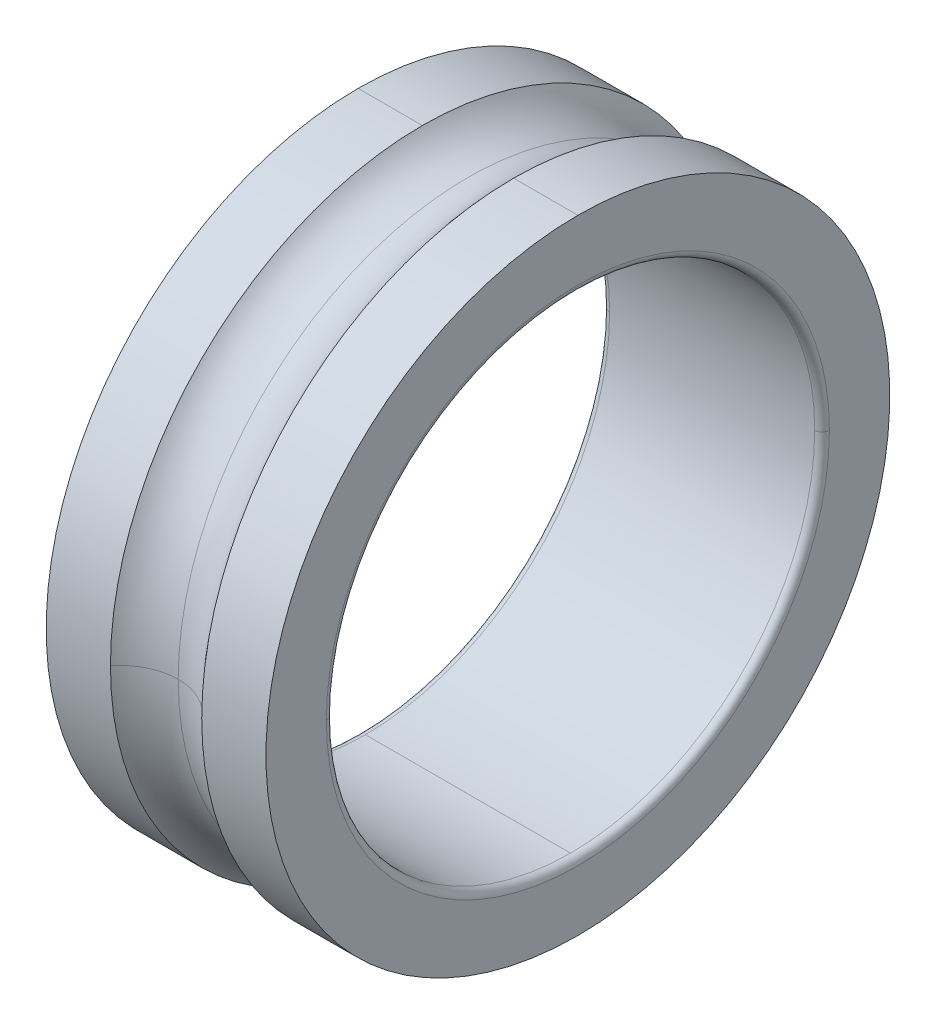
ISO-10303-21;
HEADER;
FILE_DESCRIPTION(('STEP AP214'),'2;1');
FILE_NAME('part.step','',(''),(''),'','','');
FILE_SCHEMA(('AUTOMOTIVE_DESIGN { 1 0 10303 214 1 1 1 1 }'));
ENDSEC;
DATA;
#1=APPLICATION_CONTEXT('core data for automotive mechanical design processes');
#2=APPLICATION_PROTOCOL_DEFINITION('international standard','automotive_design',2000,#1);
#3=PRODUCT_CONTEXT('',#1,'mechanical');
#4=PRODUCT('Part','Part','',(#3));
#5=PRODUCT_RELATED_PRODUCT_CATEGORY('part','',(#4));
#6=PRODUCT_DEFINITION_FORMATION('','',#4);
#7=PRODUCT_DEFINITION_CONTEXT('part definition',#1,'design');
#8=PRODUCT_DEFINITION('design','',#6,#7);
#9=PRODUCT_DEFINITION_SHAPE('','',#8);
#10=(LENGTH_UNIT() NAMED_UNIT(*) SI_UNIT(.MILLI.,.METRE.));
#11=(NAMED_UNIT(*) PLANE_ANGLE_UNIT() SI_UNIT($,.RADIAN.));
#12=(NAMED_UNIT(*) SI_UNIT($,.STERADIAN.) SOLID_ANGLE_UNIT());
#13=UNCERTAINTY_MEASURE_WITH_UNIT(LENGTH_MEASURE(1.E-05),#10,'distance_accuracy_value','');
#14=(GEOMETRIC_REPRESENTATION_CONTEXT(3) GLOBAL_UNCERTAINTY_ASSIGNED_CONTEXT((#13)) GLOBAL_UNIT_ASSIGNED_CONTEXT((#10,
#11,#12)) REPRESENTATION_CONTEXT('',''));
#15=CARTESIAN_POINT('',(0.,0.,0.));
#16=DIRECTION('',(0.,0.,1.));
#17=DIRECTION('',(1.,0.,0.));
#18=AXIS2_PLACEMENT_3D('',#15,#16,#17);
#19=CARTESIAN_POINT('',(7.6845501591675,0.,0.));
#20=DIRECTION('',(1.,0.,0.));
#21=DIRECTION('',(0.,1.,0.));
#22=AXIS2_PLACEMENT_3D('',#19,#20,#21);
#23=CYLINDRICAL_SURFACE('',#22,12.775);
#24=DIRECTION('',(1.,0.,0.));
#25=VECTOR('',#24,1.);
#26=CARTESIAN_POINT('',(7.6845501591675,12.775,0.));
#27=LINE('',#26,#25);
#28=CARTESIAN_POINT('',(6.36910031833499,12.775,0.));
#29=VERTEX_POINT('',#28);
#30=CARTESIAN_POINT('',(9.,12.775,0.));
#31=VERTEX_POINT('',#30);
#32=EDGE_CURVE('E184',#29,#31,#27,.T.);
#33=ORIENTED_EDGE('',*,*,#32,.T.);
#34=CARTESIAN_POINT('',(9.,0.,0.));
#35=DIRECTION('',(1.,0.,0.));
#36=DIRECTION('',(0.,1.,0.));
#37=AXIS2_PLACEMENT_3D('',#34,#35,#36);
#38=CIRCLE('',#37,12.775);
#39=CARTESIAN_POINT('',(9.,-12.775,0.));
#40=VERTEX_POINT('',#39);
#41=EDGE_CURVE('E138',#40,#31,#38,.T.);
#42=ORIENTED_EDGE('',*,*,#41,.F.);
#43=DIRECTION('',(-1.,0.,0.));
#44=VECTOR('',#43,1.);
#45=CARTESIAN_POINT('',(7.6845501591675,-12.775,0.));
#46=LINE('',#45,#44);
#47=CARTESIAN_POINT('',(6.36910031833499,-12.775,0.));
#48=VERTEX_POINT('',#47);
#49=EDGE_CURVE('E192',#40,#48,#46,.T.);
#50=ORIENTED_EDGE('',*,*,#49,.T.);
#51=CARTESIAN_POINT('',(6.36910031833499,0.,0.));
#52=DIRECTION('',(1.,0.,0.));
#53=DIRECTION('',(0.,1.,0.));
#54=AXIS2_PLACEMENT_3D('',#51,#52,#53);
#55=CIRCLE('',#54,12.775);
#56=CARTESIAN_POINT('',(6.36910031833499,0.,-12.775));
#57=VERTEX_POINT('',#56);
#58=EDGE_CURVE('E175',#48,#57,#55,.T.);
#59=ORIENTED_EDGE('',*,*,#58,.T.);
#60=CARTESIAN_POINT('',(6.36910031833499,0.,0.));
#61=DIRECTION('',(1.,0.,0.));
#62=DIRECTION('',(0.,1.,0.));
#63=AXIS2_PLACEMENT_3D('',#60,#61,#62);
#64=CIRCLE('',#63,12.775);
#65=EDGE_CURVE('E181',#57,#29,#64,.T.);
#66=ORIENTED_EDGE('',*,*,#65,.T.);
#67=EDGE_LOOP('',(#33,#42,#50,#59,#66));
#68=FACE_BOUND('',#67,.T.);
#69=ADVANCED_FACE('F17',(#68),#23,.T.);
#70=CARTESIAN_POINT('',(4.5,0.,0.));
#71=DIRECTION('',(1.,0.,0.));
#72=DIRECTION('',(0.,0.,-1.));
#73=AXIS2_PLACEMENT_3D('',#70,#71,#72);
#74=TOROIDAL_SURFACE('',#73,14.25,2.381);
#75=CARTESIAN_POINT('',(4.5,0.,0.));
#76=DIRECTION('',(-1.,0.,0.));
#77=DIRECTION('',(0.,0.,1.));
#78=AXIS2_PLACEMENT_3D('',#75,#76,#77);
#79=CIRCLE('',#78,11.869);
#80=CARTESIAN_POINT('',(4.5,0.,11.869));
#81=VERTEX_POINT('',#80);
#82=CARTESIAN_POINT('',(4.5,0.,-11.869));
#83=VERTEX_POINT('',#82);
#84=EDGE_CURVE('E168',#81,#83,#79,.T.);
#85=ORIENTED_EDGE('',*,*,#84,.T.);
#86=CARTESIAN_POINT('',(4.5,0.,-14.25));
#87=DIRECTION('',(0.,-1.,0.));
#88=DIRECTION('',(0.,0.,-1.));
#89=AXIS2_PLACEMENT_3D('',#86,#87,#88);
#90=CIRCLE('',#89,2.381);
#91=CARTESIAN_POINT('',(2.630899681665,0.,-12.775));
#92=VERTEX_POINT('',#91);
#93=EDGE_CURVE('E161',#83,#92,#90,.T.);
#94=ORIENTED_EDGE('',*,*,#93,.T.);
#95=CARTESIAN_POINT('',(2.630899681665,0.,0.));
#96=DIRECTION('',(1.,0.,0.));
#97=DIRECTION('',(0.,1.,0.));
#98=AXIS2_PLACEMENT_3D('',#95,#96,#97);
#99=CIRCLE('',#98,12.775);
#100=CARTESIAN_POINT('',(2.630899681665,12.775,0.));
#101=VERTEX_POINT('',#100);
#102=EDGE_CURVE('E11',#92,#101,#99,.T.);
#103=ORIENTED_EDGE('',*,*,#102,.T.);
#104=CARTESIAN_POINT('',(2.630899681665,0.,0.));
#105=DIRECTION('',(1.,0.,0.));
#106=DIRECTION('',(0.,1.,0.));
#107=AXIS2_PLACEMENT_3D('',#104,#105,#106);
#108=CIRCLE('',#107,12.775);
#109=CARTESIAN_POINT('',(2.630899681665,0.,12.775));
#110=VERTEX_POINT('',#109);
#111=EDGE_CURVE('E160',#101,#110,#108,.T.);
#112=ORIENTED_EDGE('',*,*,#111,.T.);
#113=CARTESIAN_POINT('',(4.5,0.,14.25));
#114=DIRECTION('',(0.,-1.,0.));
#115=DIRECTION('',(0.,0.,1.));
#116=AXIS2_PLACEMENT_3D('',#113,#114,#115);
#117=CIRCLE('',#116,2.381);
#118=EDGE_CURVE('E202',#110,#81,#117,.T.);
#119=ORIENTED_EDGE('',*,*,#118,.T.);
#120=EDGE_LOOP('',(#85,#94,#103,#112,#119));
#121=FACE_BOUND('',#120,.T.);
#122=ADVANCED_FACE('F260',(#121),#74,.F.);
#123=CARTESIAN_POINT('',(1.3154498408325,0.,0.));
#124=DIRECTION('',(1.,0.,0.));
#125=DIRECTION('',(0.,1.,0.));
#126=AXIS2_PLACEMENT_3D('',#123,#124,#125);
#127=CYLINDRICAL_SURFACE('',#126,12.775);
#128=DIRECTION('',(1.,0.,0.));
#129=VECTOR('',#128,1.);
#130=CARTESIAN_POINT('',(1.3154498408325,12.775,0.));
#131=LINE('',#130,#129);
#132=CARTESIAN_POINT('',(0.,12.775,0.));
#133=VERTEX_POINT('',#132);
#134=EDGE_CURVE('E149',#133,#101,#131,.T.);
#135=ORIENTED_EDGE('',*,*,#134,.T.);
#136=ORIENTED_EDGE('',*,*,#102,.F.);
#137=CARTESIAN_POINT('',(2.630899681665,0.,0.));
#138=DIRECTION('',(1.,0.,0.));
#139=DIRECTION('',(0.,1.,0.));
#140=AXIS2_PLACEMENT_3D('',#137,#138,#139);
#141=CIRCLE('',#140,12.775);
#142=CARTESIAN_POINT('',(2.630899681665,-12.775,0.));
#143=VERTEX_POINT('',#142);
#144=EDGE_CURVE('E164',#143,#92,#141,.T.);
#145=ORIENTED_EDGE('',*,*,#144,.F.);
#146=DIRECTION('',(-1.,0.,0.));
#147=VECTOR('',#146,1.);
#148=CARTESIAN_POINT('',(1.3154498408325,-12.775,0.));
#149=LINE('',#148,#147);
#150=CARTESIAN_POINT('',(0.,-12.775,0.));
#151=VERTEX_POINT('',#150);
#152=EDGE_CURVE('E151',#143,#151,#149,.T.);
#153=ORIENTED_EDGE('',*,*,#152,.T.);
#154=CARTESIAN_POINT('',(0.,0.,0.));
#155=DIRECTION('',(1.,0.,0.));
#156=DIRECTION('',(0.,1.,0.));
#157=AXIS2_PLACEMENT_3D('',#154,#155,#156);
#158=CIRCLE('',#157,12.775);
#159=EDGE_CURVE('E25',#151,#133,#158,.T.);
#160=ORIENTED_EDGE('',*,*,#159,.T.);
#161=EDGE_LOOP('',(#135,#136,#145,#153,#160));
#162=FACE_BOUND('',#161,.T.);
#163=ADVANCED_FACE('F147',(#162),#127,.T.);
#164=CARTESIAN_POINT('',(0.,11.5375,0.));
#165=DIRECTION('',(-1.,0.,0.));
#166=DIRECTION('',(0.,0.,1.));
#167=AXIS2_PLACEMENT_3D('',#164,#165,#166);
#168=PLANE('',#167);
#169=CARTESIAN_POINT('',(0.,0.,0.));
#170=DIRECTION('',(1.,0.,0.));
#171=DIRECTION('',(0.,1.,0.));
#172=AXIS2_PLACEMENT_3D('',#169,#170,#171);
#173=CIRCLE('',#172,10.3);
#174=CARTESIAN_POINT('',(0.,0.,10.3));
#175=VERTEX_POINT('',#174);
#176=CARTESIAN_POINT('',(0.,0.,-10.3));
#177=VERTEX_POINT('',#176);
#178=EDGE_CURVE('E141',#175,#177,#173,.T.);
#179=ORIENTED_EDGE('',*,*,#178,.T.);
#180=CARTESIAN_POINT('',(0.,0.,0.));
#181=DIRECTION('',(1.,0.,0.));
#182=DIRECTION('',(0.,1.,0.));
#183=AXIS2_PLACEMENT_3D('',#180,#181,#182);
#184=CIRCLE('',#183,10.3);
#185=EDGE_CURVE('E223',#177,#175,#184,.T.);
#186=ORIENTED_EDGE('',*,*,#185,.T.);
#187=EDGE_LOOP('',(#179,#186));
#188=FACE_BOUND('',#187,.T.);
#189=CARTESIAN_POINT('',(0.,0.,0.));
#190=DIRECTION('',(1.,0.,0.));
#191=DIRECTION('',(0.,1.,0.));
#192=AXIS2_PLACEMENT_3D('',#189,#190,#191);
#193=CIRCLE('',#192,12.775);
#194=EDGE_CURVE('E154',#133,#151,#193,.T.);
#195=ORIENTED_EDGE('',*,*,#194,.F.);
#196=ORIENTED_EDGE('',*,*,#159,.F.);
#197=EDGE_LOOP('',(#195,#196));
#198=FACE_BOUND('',#197,.T.);
#199=ADVANCED_FACE('F19',(#188,#198),#168,.T.);
#200=CARTESIAN_POINT('',(0.3,0.,0.));
#201=DIRECTION('',(1.,0.,0.));
#202=DIRECTION('',(0.,0.,-1.));
#203=AXIS2_PLACEMENT_3D('',#200,#201,#202);
#204=TOROIDAL_SURFACE('',#203,10.3,0.3);
#205=CARTESIAN_POINT('',(0.3,0.,-10.3));
#206=DIRECTION('',(0.,-1.,0.));
#207=DIRECTION('',(0.,0.,-1.));
#208=AXIS2_PLACEMENT_3D('',#205,#206,#207);
#209=CIRCLE('',#208,0.3);
#210=CARTESIAN_POINT('',(0.3,0.,-10.));
#211=VERTEX_POINT('',#210);
#212=EDGE_CURVE('E211',#211,#177,#209,.T.);
#213=ORIENTED_EDGE('',*,*,#212,.T.);
#214=ORIENTED_EDGE('',*,*,#178,.F.);
#215=CARTESIAN_POINT('',(0.3,0.,10.3));
#216=DIRECTION('',(0.,-1.,0.));
#217=DIRECTION('',(0.,0.,1.));
#218=AXIS2_PLACEMENT_3D('',#215,#216,#217);
#219=CIRCLE('',#218,0.3);
#220=CARTESIAN_POINT('',(0.3,0.,10.));
#221=VERTEX_POINT('',#220);
#222=EDGE_CURVE('E220',#175,#221,#219,.T.);
#223=ORIENTED_EDGE('',*,*,#222,.T.);
#224=CARTESIAN_POINT('',(0.3,0.,0.));
#225=DIRECTION('',(1.,0.,0.));
#226=DIRECTION('',(0.,1.,0.));
#227=AXIS2_PLACEMENT_3D('',#224,#225,#226);
#228=CIRCLE('',#227,10.);
#229=CARTESIAN_POINT('',(0.3,-10.,0.));
#230=VERTEX_POINT('',#229);
#231=EDGE_CURVE('E139',#221,#230,#228,.T.);
#232=ORIENTED_EDGE('',*,*,#231,.T.);
#233=CARTESIAN_POINT('',(0.3,0.,0.));
#234=DIRECTION('',(1.,0.,0.));
#235=DIRECTION('',(0.,1.,0.));
#236=AXIS2_PLACEMENT_3D('',#233,#234,#235);
#237=CIRCLE('',#236,10.);
#238=EDGE_CURVE('E131',#230,#211,#237,.T.);
#239=ORIENTED_EDGE('',*,*,#238,.T.);
#240=EDGE_LOOP('',(#213,#214,#223,#232,#239));
#241=FACE_BOUND('',#240,.T.);
#242=ADVANCED_FACE('F229',(#241),#204,.T.);
#243=CARTESIAN_POINT('',(4.5,0.,0.));
#244=DIRECTION('',(1.,0.,0.));
#245=DIRECTION('',(0.,1.,0.));
#246=AXIS2_PLACEMENT_3D('',#243,#244,#245);
#247=CYLINDRICAL_SURFACE('',#246,10.);
#248=DIRECTION('',(1.,0.,0.));
#249=VECTOR('',#248,1.);
#250=CARTESIAN_POINT('',(4.5,10.,0.));
#251=LINE('',#250,#249);
#252=CARTESIAN_POINT('',(0.3,10.,0.));
#253=VERTEX_POINT('',#252);
#254=CARTESIAN_POINT('',(8.7,10.,0.));
#255=VERTEX_POINT('',#254);
#256=EDGE_CURVE('E226',#253,#255,#251,.T.);
#257=ORIENTED_EDGE('',*,*,#256,.T.);
#258=CARTESIAN_POINT('',(8.7,0.,0.));
#259=DIRECTION('',(1.,0.,0.));
#260=DIRECTION('',(0.,1.,0.));
#261=AXIS2_PLACEMENT_3D('',#258,#259,#260);
#262=CIRCLE('',#261,10.);
#263=CARTESIAN_POINT('',(8.7,0.,10.));
#264=VERTEX_POINT('',#263);
#265=EDGE_CURVE('E122',#255,#264,#262,.T.);
#266=ORIENTED_EDGE('',*,*,#265,.T.);
#267=CARTESIAN_POINT('',(8.7,0.,0.));
#268=DIRECTION('',(1.,0.,0.));
#269=DIRECTION('',(0.,1.,0.));
#270=AXIS2_PLACEMENT_3D('',#267,#268,#269);
#271=CIRCLE('',#270,10.);
#272=CARTESIAN_POINT('',(8.7,-10.,0.));
#273=VERTEX_POINT('',#272);
#274=EDGE_CURVE('E32',#264,#273,#271,.T.);
#275=ORIENTED_EDGE('',*,*,#274,.T.);
#276=DIRECTION('',(-1.,0.,0.));
#277=VECTOR('',#276,1.);
#278=CARTESIAN_POINT('',(4.5,-10.,0.));
#279=LINE('',#278,#277);
#280=EDGE_CURVE('E129',#273,#230,#279,.T.);
#281=ORIENTED_EDGE('',*,*,#280,.T.);
#282=ORIENTED_EDGE('',*,*,#231,.F.);
#283=CARTESIAN_POINT('',(0.3,0.,0.));
#284=DIRECTION('',(1.,0.,0.));
#285=DIRECTION('',(0.,1.,0.));
#286=AXIS2_PLACEMENT_3D('',#283,#284,#285);
#287=CIRCLE('',#286,10.);
#288=EDGE_CURVE('E217',#253,#221,#287,.T.);
#289=ORIENTED_EDGE('',*,*,#288,.F.);
#290=EDGE_LOOP('',(#257,#266,#275,#281,#282,#289));
#291=FACE_BOUND('',#290,.T.);
#292=ADVANCED_FACE('F238',(#291),#247,.F.);
#293=CARTESIAN_POINT('',(8.7,0.,0.));
#294=DIRECTION('',(1.,0.,0.));
#295=DIRECTION('',(0.,0.,-1.));
#296=AXIS2_PLACEMENT_3D('',#293,#294,#295);
#297=TOROIDAL_SURFACE('',#296,10.3,0.3);
#298=CARTESIAN_POINT('',(8.7,0.,-10.3));
#299=DIRECTION('',(0.,-1.,0.));
#300=DIRECTION('',(0.,0.,-1.));
#301=AXIS2_PLACEMENT_3D('',#298,#299,#300);
#302=CIRCLE('',#301,0.3);
#303=CARTESIAN_POINT('',(9.,0.,-10.3));
#304=VERTEX_POINT('',#303);
#305=CARTESIAN_POINT('',(8.7,0.,-10.));
#306=VERTEX_POINT('',#305);
#307=EDGE_CURVE('E108',#304,#306,#302,.T.);
#308=ORIENTED_EDGE('',*,*,#307,.T.);
#309=CARTESIAN_POINT('',(8.7,0.,0.));
#310=DIRECTION('',(1.,0.,0.));
#311=DIRECTION('',(0.,1.,0.));
#312=AXIS2_PLACEMENT_3D('',#309,#310,#311);
#313=CIRCLE('',#312,10.);
#314=EDGE_CURVE('E112',#273,#306,#313,.T.);
#315=ORIENTED_EDGE('',*,*,#314,.F.);
#316=ORIENTED_EDGE('',*,*,#274,.F.);
#317=CARTESIAN_POINT('',(8.7,0.,10.3));
#318=DIRECTION('',(0.,-1.,0.));
#319=DIRECTION('',(0.,0.,1.));
#320=AXIS2_PLACEMENT_3D('',#317,#318,#319);
#321=CIRCLE('',#320,0.3);
#322=CARTESIAN_POINT('',(9.,0.,10.3));
#323=VERTEX_POINT('',#322);
#324=EDGE_CURVE('E135',#264,#323,#321,.T.);
#325=ORIENTED_EDGE('',*,*,#324,.T.);
#326=CARTESIAN_POINT('',(9.,0.,0.));
#327=DIRECTION('',(1.,0.,0.));
#328=DIRECTION('',(0.,1.,0.));
#329=AXIS2_PLACEMENT_3D('',#326,#327,#328);
#330=CIRCLE('',#329,10.3);
#331=EDGE_CURVE('E40',#323,#304,#330,.T.);
#332=ORIENTED_EDGE('',*,*,#331,.T.);
#333=EDGE_LOOP('',(#308,#315,#316,#325,#332));
#334=FACE_BOUND('',#333,.T.);
#335=ADVANCED_FACE('F110',(#334),#297,.T.);
#336=CARTESIAN_POINT('',(9.,11.5375,0.));
#337=DIRECTION('',(1.,0.,0.));
#338=DIRECTION('',(0.,1.,0.));
#339=AXIS2_PLACEMENT_3D('',#336,#337,#338);
#340=PLANE('',#339);
#341=CARTESIAN_POINT('',(9.,0.,0.));
#342=DIRECTION('',(1.,0.,0.));
#343=DIRECTION('',(0.,1.,0.));
#344=AXIS2_PLACEMENT_3D('',#341,#342,#343);
#345=CIRCLE('',#344,10.3);
#346=EDGE_CURVE('E116',#304,#323,#345,.T.);
#347=ORIENTED_EDGE('',*,*,#346,.F.);
#348=ORIENTED_EDGE('',*,*,#331,.F.);
#349=EDGE_LOOP('',(#347,#348));
#350=FACE_BOUND('',#349,.T.);
#351=CARTESIAN_POINT('',(9.,0.,0.));
#352=DIRECTION('',(1.,0.,0.));
#353=DIRECTION('',(0.,1.,0.));
#354=AXIS2_PLACEMENT_3D('',#351,#352,#353);
#355=CIRCLE('',#354,12.775);
#356=EDGE_CURVE('E194',#31,#40,#355,.T.);
#357=ORIENTED_EDGE('',*,*,#356,.T.);
#358=ORIENTED_EDGE('',*,*,#41,.T.);
#359=EDGE_LOOP('',(#357,#358));
#360=FACE_BOUND('',#359,.T.);
#361=ADVANCED_FACE('F239',(#350,#360),#340,.T.);
#362=CARTESIAN_POINT('',(8.7,0.,0.));
#363=DIRECTION('',(1.,0.,0.));
#364=DIRECTION('',(0.,0.,-1.));
#365=AXIS2_PLACEMENT_3D('',#362,#363,#364);
#366=TOROIDAL_SURFACE('',#365,10.3,0.3);
#367=ORIENTED_EDGE('',*,*,#307,.F.);
#368=ORIENTED_EDGE('',*,*,#346,.T.);
#369=ORIENTED_EDGE('',*,*,#324,.F.);
#370=ORIENTED_EDGE('',*,*,#265,.F.);
#371=CARTESIAN_POINT('',(8.7,0.,0.));
#372=DIRECTION('',(1.,0.,0.));
#373=DIRECTION('',(0.,1.,0.));
#374=AXIS2_PLACEMENT_3D('',#371,#372,#373);
#375=CIRCLE('',#374,10.);
#376=EDGE_CURVE('E117',#306,#255,#375,.T.);
#377=ORIENTED_EDGE('',*,*,#376,.F.);
#378=EDGE_LOOP('',(#367,#368,#369,#370,#377));
#379=FACE_BOUND('',#378,.T.);
#380=ADVANCED_FACE('F120',(#379),#366,.T.);
#381=CARTESIAN_POINT('',(4.5,0.,0.));
#382=DIRECTION('',(1.,0.,0.));
#383=DIRECTION('',(0.,1.,0.));
#384=AXIS2_PLACEMENT_3D('',#381,#382,#383);
#385=CYLINDRICAL_SURFACE('',#384,10.);
#386=ORIENTED_EDGE('',*,*,#256,.F.);
#387=CARTESIAN_POINT('',(0.3,0.,0.));
#388=DIRECTION('',(1.,0.,0.));
#389=DIRECTION('',(0.,1.,0.));
#390=AXIS2_PLACEMENT_3D('',#387,#388,#389);
#391=CIRCLE('',#390,10.);
#392=EDGE_CURVE('E214',#211,#253,#391,.T.);
#393=ORIENTED_EDGE('',*,*,#392,.F.);
#394=ORIENTED_EDGE('',*,*,#238,.F.);
#395=ORIENTED_EDGE('',*,*,#280,.F.);
#396=ORIENTED_EDGE('',*,*,#314,.T.);
#397=ORIENTED_EDGE('',*,*,#376,.T.);
#398=EDGE_LOOP('',(#386,#393,#394,#395,#396,#397));
#399=FACE_BOUND('',#398,.T.);
#400=ADVANCED_FACE('F126',(#399),#385,.F.);
#401=CARTESIAN_POINT('',(0.3,0.,0.));
#402=DIRECTION('',(1.,0.,0.));
#403=DIRECTION('',(0.,0.,-1.));
#404=AXIS2_PLACEMENT_3D('',#401,#402,#403);
#405=TOROIDAL_SURFACE('',#404,10.3,0.3);
#406=ORIENTED_EDGE('',*,*,#212,.F.);
#407=ORIENTED_EDGE('',*,*,#392,.T.);
#408=ORIENTED_EDGE('',*,*,#288,.T.);
#409=ORIENTED_EDGE('',*,*,#222,.F.);
#410=ORIENTED_EDGE('',*,*,#185,.F.);
#411=EDGE_LOOP('',(#406,#407,#408,#409,#410));
#412=FACE_BOUND('',#411,.T.);
#413=ADVANCED_FACE('F234',(#412),#405,.T.);
#414=CARTESIAN_POINT('',(1.3154498408325,0.,0.));
#415=DIRECTION('',(1.,0.,0.));
#416=DIRECTION('',(0.,1.,0.));
#417=AXIS2_PLACEMENT_3D('',#414,#415,#416);
#418=CYLINDRICAL_SURFACE('',#417,12.775);
#419=ORIENTED_EDGE('',*,*,#134,.F.);
#420=ORIENTED_EDGE('',*,*,#194,.T.);
#421=ORIENTED_EDGE('',*,*,#152,.F.);
#422=CARTESIAN_POINT('',(2.630899681665,0.,0.));
#423=DIRECTION('',(1.,0.,0.));
#424=DIRECTION('',(0.,1.,0.));
#425=AXIS2_PLACEMENT_3D('',#422,#423,#424);
#426=CIRCLE('',#425,12.775);
#427=EDGE_CURVE('E204',#110,#143,#426,.T.);
#428=ORIENTED_EDGE('',*,*,#427,.F.);
#429=ORIENTED_EDGE('',*,*,#111,.F.);
#430=EDGE_LOOP('',(#419,#420,#421,#428,#429));
#431=FACE_BOUND('',#430,.T.);
#432=ADVANCED_FACE('F158',(#431),#418,.T.);
#433=CARTESIAN_POINT('',(4.5,0.,0.));
#434=DIRECTION('',(1.,0.,0.));
#435=DIRECTION('',(0.,0.,-1.));
#436=AXIS2_PLACEMENT_3D('',#433,#434,#435);
#437=TOROIDAL_SURFACE('',#436,14.25,2.381);
#438=CARTESIAN_POINT('',(4.5,0.,0.));
#439=DIRECTION('',(-1.,0.,0.));
#440=DIRECTION('',(0.,0.,1.));
#441=AXIS2_PLACEMENT_3D('',#438,#439,#440);
#442=CIRCLE('',#441,11.869);
#443=EDGE_CURVE('E178',#83,#81,#442,.T.);
#444=ORIENTED_EDGE('',*,*,#443,.T.);
#445=ORIENTED_EDGE('',*,*,#118,.F.);
#446=ORIENTED_EDGE('',*,*,#427,.T.);
#447=ORIENTED_EDGE('',*,*,#144,.T.);
#448=ORIENTED_EDGE('',*,*,#93,.F.);
#449=EDGE_LOOP('',(#444,#445,#446,#447,#448));
#450=FACE_BOUND('',#449,.T.);
#451=ADVANCED_FACE('F263',(#450),#437,.F.);
#452=CARTESIAN_POINT('',(7.6845501591675,0.,0.));
#453=DIRECTION('',(1.,0.,0.));
#454=DIRECTION('',(0.,1.,0.));
#455=AXIS2_PLACEMENT_3D('',#452,#453,#454);
#456=CYLINDRICAL_SURFACE('',#455,12.775);
#457=ORIENTED_EDGE('',*,*,#32,.F.);
#458=CARTESIAN_POINT('',(6.36910031833499,0.,0.));
#459=DIRECTION('',(1.,0.,0.));
#460=DIRECTION('',(0.,1.,0.));
#461=AXIS2_PLACEMENT_3D('',#458,#459,#460);
#462=CIRCLE('',#461,12.775);
#463=CARTESIAN_POINT('',(6.36910031833499,0.,12.775));
#464=VERTEX_POINT('',#463);
#465=EDGE_CURVE('E174',#29,#464,#462,.T.);
#466=ORIENTED_EDGE('',*,*,#465,.T.);
#467=CARTESIAN_POINT('',(6.36910031833499,0.,0.));
#468=DIRECTION('',(1.,0.,0.));
#469=DIRECTION('',(0.,1.,0.));
#470=AXIS2_PLACEMENT_3D('',#467,#468,#469);
#471=CIRCLE('',#470,12.775);
#472=EDGE_CURVE('E177',#464,#48,#471,.T.);
#473=ORIENTED_EDGE('',*,*,#472,.T.);
#474=ORIENTED_EDGE('',*,*,#49,.F.);
#475=ORIENTED_EDGE('',*,*,#356,.F.);
#476=EDGE_LOOP('',(#457,#466,#473,#474,#475));
#477=FACE_BOUND('',#476,.T.);
#478=ADVANCED_FACE('F246',(#477),#456,.T.);
#479=CARTESIAN_POINT('',(4.5,0.,0.));
#480=DIRECTION('',(1.,0.,0.));
#481=DIRECTION('',(0.,0.,-1.));
#482=AXIS2_PLACEMENT_3D('',#479,#480,#481);
#483=TOROIDAL_SURFACE('',#482,14.25,2.381);
#484=ORIENTED_EDGE('',*,*,#443,.F.);
#485=CARTESIAN_POINT('',(4.5,0.,-14.25));
#486=DIRECTION('',(0.,-1.,0.));
#487=DIRECTION('',(0.,0.,-1.));
#488=AXIS2_PLACEMENT_3D('',#485,#486,#487);
#489=CIRCLE('',#488,2.381);
#490=EDGE_CURVE('E188',#57,#83,#489,.T.);
#491=ORIENTED_EDGE('',*,*,#490,.F.);
#492=ORIENTED_EDGE('',*,*,#58,.F.);
#493=ORIENTED_EDGE('',*,*,#472,.F.);
#494=CARTESIAN_POINT('',(4.5,0.,14.25));
#495=DIRECTION('',(0.,-1.,0.));
#496=DIRECTION('',(0.,0.,1.));
#497=AXIS2_PLACEMENT_3D('',#494,#495,#496);
#498=CIRCLE('',#497,2.381);
#499=EDGE_CURVE('E171',#81,#464,#498,.T.);
#500=ORIENTED_EDGE('',*,*,#499,.F.);
#501=EDGE_LOOP('',(#484,#491,#492,#493,#500));
#502=FACE_BOUND('',#501,.T.);
#503=ADVANCED_FACE('F258',(#502),#483,.F.);
#504=CARTESIAN_POINT('',(4.5,0.,0.));
#505=DIRECTION('',(1.,0.,0.));
#506=DIRECTION('',(0.,0.,-1.));
#507=AXIS2_PLACEMENT_3D('',#504,#505,#506);
#508=TOROIDAL_SURFACE('',#507,14.25,2.381);
#509=ORIENTED_EDGE('',*,*,#84,.F.);
#510=ORIENTED_EDGE('',*,*,#499,.T.);
#511=ORIENTED_EDGE('',*,*,#465,.F.);
#512=ORIENTED_EDGE('',*,*,#65,.F.);
#513=ORIENTED_EDGE('',*,*,#490,.T.);
#514=EDGE_LOOP('',(#509,#510,#511,#512,#513));
#515=FACE_BOUND('',#514,.T.);
#516=ADVANCED_FACE('F255',(#515),#508,.F.);
#517=CLOSED_SHELL('',(#69,#122,#163,#199,#242,#292,#335,#361,#380,#400,#413,#432,#451,#478,#503,#516));
#518=MANIFOLD_SOLID_BREP('B1',#517);
#519=ADVANCED_BREP_SHAPE_REPRESENTATION('',(#18,#518),#14);
#520=SHAPE_DEFINITION_REPRESENTATION(#9,#519);
ENDSEC;
END-ISO-10303-21;
